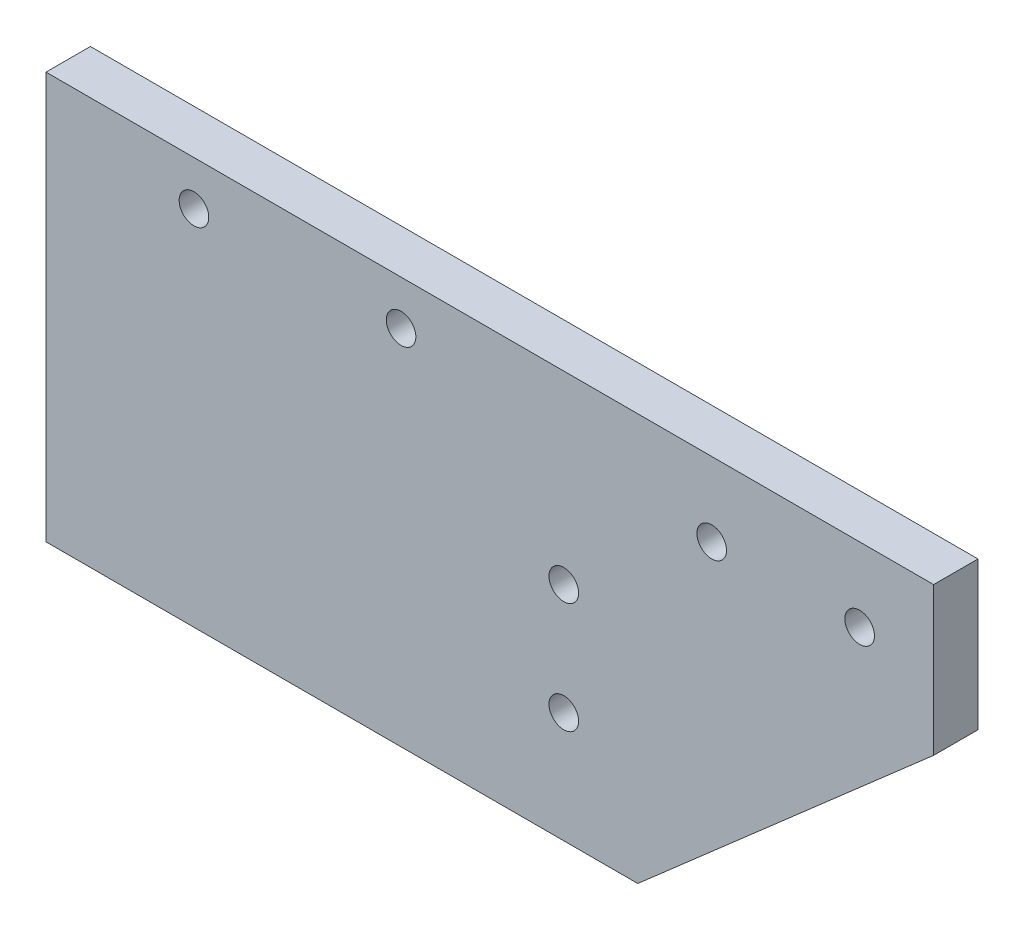
ISO-10303-21;
HEADER;
FILE_DESCRIPTION(('STEP AP214'),'2;1');
FILE_NAME('part.step','',(''),(''),'','','');
FILE_SCHEMA(('AUTOMOTIVE_DESIGN { 1 0 10303 214 1 1 1 1 }'));
ENDSEC;
DATA;
#1=APPLICATION_CONTEXT('core data for automotive mechanical design processes');
#2=APPLICATION_PROTOCOL_DEFINITION('international standard','automotive_design',2000,#1);
#3=PRODUCT_CONTEXT('',#1,'mechanical');
#4=PRODUCT('Part','Part','',(#3));
#5=PRODUCT_RELATED_PRODUCT_CATEGORY('part','',(#4));
#6=PRODUCT_DEFINITION_FORMATION('','',#4);
#7=PRODUCT_DEFINITION_CONTEXT('part definition',#1,'design');
#8=PRODUCT_DEFINITION('design','',#6,#7);
#9=PRODUCT_DEFINITION_SHAPE('','',#8);
#10=(LENGTH_UNIT() NAMED_UNIT(*) SI_UNIT(.MILLI.,.METRE.));
#11=(NAMED_UNIT(*) PLANE_ANGLE_UNIT() SI_UNIT($,.RADIAN.));
#12=(NAMED_UNIT(*) SI_UNIT($,.STERADIAN.) SOLID_ANGLE_UNIT());
#13=UNCERTAINTY_MEASURE_WITH_UNIT(LENGTH_MEASURE(1.E-05),#10,'distance_accuracy_value','');
#14=(GEOMETRIC_REPRESENTATION_CONTEXT(3) GLOBAL_UNCERTAINTY_ASSIGNED_CONTEXT((#13)) GLOBAL_UNIT_ASSIGNED_CONTEXT((#10,
#11,#12)) REPRESENTATION_CONTEXT('',''));
#15=CARTESIAN_POINT('',(0.,0.,0.));
#16=DIRECTION('',(0.,0.,1.));
#17=DIRECTION('',(1.,0.,0.));
#18=AXIS2_PLACEMENT_3D('',#15,#16,#17);
#19=CARTESIAN_POINT('',(0.,0.,6.));
#20=DIRECTION('',(0.,0.,-1.));
#21=DIRECTION('',(-1.,0.,0.));
#22=AXIS2_PLACEMENT_3D('',#19,#20,#21);
#23=PLANE('',#22);
#24=DIRECTION('',(-1.,0.,0.));
#25=VECTOR('',#24,1.);
#26=CARTESIAN_POINT('',(-60.,0.,6.));
#27=LINE('',#26,#25);
#28=CARTESIAN_POINT('',(60.,0.,6.));
#29=VERTEX_POINT('',#28);
#30=CARTESIAN_POINT('',(-60.,0.,6.));
#31=VERTEX_POINT('',#30);
#32=EDGE_CURVE('E50',#29,#31,#27,.T.);
#33=ORIENTED_EDGE('',*,*,#32,.T.);
#34=DIRECTION('',(0.,-1.,0.));
#35=VECTOR('',#34,1.);
#36=CARTESIAN_POINT('',(-60.,-55.,6.));
#37=LINE('',#36,#35);
#38=CARTESIAN_POINT('',(-60.,-55.,6.));
#39=VERTEX_POINT('',#38);
#40=EDGE_CURVE('E85',#31,#39,#37,.T.);
#41=ORIENTED_EDGE('',*,*,#40,.T.);
#42=DIRECTION('',(1.,0.,0.));
#43=VECTOR('',#42,1.);
#44=CARTESIAN_POINT('',(-60.,-55.,6.));
#45=LINE('',#44,#43);
#46=CARTESIAN_POINT('',(20.,-55.,6.));
#47=VERTEX_POINT('',#46);
#48=EDGE_CURVE('E90',#39,#47,#45,.T.);
#49=ORIENTED_EDGE('',*,*,#48,.T.);
#50=DIRECTION('',(0.752576694706878,0.658504607868518,0.));
#51=VECTOR('',#50,1.);
#52=CARTESIAN_POINT('',(20.,-55.,6.));
#53=LINE('',#52,#51);
#54=CARTESIAN_POINT('',(60.,-20.,6.));
#55=VERTEX_POINT('',#54);
#56=EDGE_CURVE('E94',#47,#55,#53,.T.);
#57=ORIENTED_EDGE('',*,*,#56,.T.);
#58=DIRECTION('',(0.,1.,0.));
#59=VECTOR('',#58,1.);
#60=CARTESIAN_POINT('',(60.,0.,6.));
#61=LINE('',#60,#59);
#62=EDGE_CURVE('E105',#55,#29,#61,.T.);
#63=ORIENTED_EDGE('',*,*,#62,.T.);
#64=EDGE_LOOP('',(#33,#41,#49,#57,#63));
#65=FACE_BOUND('',#64,.T.);
#66=CARTESIAN_POINT('',(50.,-10.,6.));
#67=DIRECTION('',(0.,0.,1.));
#68=DIRECTION('',(1.,0.,0.));
#69=AXIS2_PLACEMENT_3D('',#66,#67,#68);
#70=CIRCLE('',#69,2.);
#71=CARTESIAN_POINT('',(52.,-10.,6.));
#72=VERTEX_POINT('',#71);
#73=EDGE_CURVE('E114',#72,#72,#70,.T.);
#74=ORIENTED_EDGE('',*,*,#73,.F.);
#75=EDGE_LOOP('',(#74));
#76=FACE_BOUND('',#75,.T.);
#77=CARTESIAN_POINT('',(30.,-10.,6.));
#78=DIRECTION('',(0.,0.,1.));
#79=DIRECTION('',(1.,0.,0.));
#80=AXIS2_PLACEMENT_3D('',#77,#78,#79);
#81=CIRCLE('',#80,2.);
#82=CARTESIAN_POINT('',(32.,-10.,6.));
#83=VERTEX_POINT('',#82);
#84=EDGE_CURVE('E133',#83,#83,#81,.T.);
#85=ORIENTED_EDGE('',*,*,#84,.F.);
#86=EDGE_LOOP('',(#85));
#87=FACE_BOUND('',#86,.T.);
#88=CARTESIAN_POINT('',(10.,-40.,6.));
#89=DIRECTION('',(0.,0.,1.));
#90=DIRECTION('',(1.,0.,0.));
#91=AXIS2_PLACEMENT_3D('',#88,#89,#90);
#92=CIRCLE('',#91,2.);
#93=CARTESIAN_POINT('',(12.,-40.,6.));
#94=VERTEX_POINT('',#93);
#95=EDGE_CURVE('E139',#94,#94,#92,.T.);
#96=ORIENTED_EDGE('',*,*,#95,.F.);
#97=EDGE_LOOP('',(#96));
#98=FACE_BOUND('',#97,.T.);
#99=CARTESIAN_POINT('',(10.,-25.,6.));
#100=DIRECTION('',(0.,0.,1.));
#101=DIRECTION('',(1.,0.,0.));
#102=AXIS2_PLACEMENT_3D('',#99,#100,#101);
#103=CIRCLE('',#102,2.);
#104=CARTESIAN_POINT('',(12.,-25.,6.));
#105=VERTEX_POINT('',#104);
#106=EDGE_CURVE('E145',#105,#105,#103,.T.);
#107=ORIENTED_EDGE('',*,*,#106,.F.);
#108=EDGE_LOOP('',(#107));
#109=FACE_BOUND('',#108,.T.);
#110=CARTESIAN_POINT('',(-39.9999999999975,-5.99999999999944,6.));
#111=DIRECTION('',(0.,0.,1.));
#112=DIRECTION('',(1.,0.,0.));
#113=AXIS2_PLACEMENT_3D('',#110,#111,#112);
#114=CIRCLE('',#113,1.99999999999827);
#115=CARTESIAN_POINT('',(-37.9999999999992,-5.99999999999944,6.));
#116=VERTEX_POINT('',#115);
#117=EDGE_CURVE('E151',#116,#116,#114,.T.);
#118=ORIENTED_EDGE('',*,*,#117,.F.);
#119=EDGE_LOOP('',(#118));
#120=FACE_BOUND('',#119,.T.);
#121=CARTESIAN_POINT('',(-11.9999999999974,-5.99999999999967,6.));
#122=DIRECTION('',(0.,0.,1.));
#123=DIRECTION('',(1.,0.,0.));
#124=AXIS2_PLACEMENT_3D('',#121,#122,#123);
#125=CIRCLE('',#124,2.00000000000225);
#126=CARTESIAN_POINT('',(-9.99999999999518,-5.99999999999967,6.));
#127=VERTEX_POINT('',#126);
#128=EDGE_CURVE('E157',#127,#127,#125,.T.);
#129=ORIENTED_EDGE('',*,*,#128,.F.);
#130=EDGE_LOOP('',(#129));
#131=FACE_BOUND('',#130,.T.);
#132=ADVANCED_FACE('F33',(#65,#76,#87,#98,#109,#120,#131),#23,.F.);
#133=CARTESIAN_POINT('',(0.,0.,0.));
#134=DIRECTION('',(0.,0.,-1.));
#135=DIRECTION('',(-1.,0.,0.));
#136=AXIS2_PLACEMENT_3D('',#133,#134,#135);
#137=PLANE('',#136);
#138=CARTESIAN_POINT('',(-39.9999999999975,-5.99999999999944,0.));
#139=DIRECTION('',(0.,0.,1.));
#140=DIRECTION('',(1.,0.,0.));
#141=AXIS2_PLACEMENT_3D('',#138,#139,#140);
#142=CIRCLE('',#141,1.99999999999827);
#143=CARTESIAN_POINT('',(-37.9999999999992,-5.99999999999944,0.));
#144=VERTEX_POINT('',#143);
#145=EDGE_CURVE('E154',#144,#144,#142,.T.);
#146=ORIENTED_EDGE('',*,*,#145,.T.);
#147=EDGE_LOOP('',(#146));
#148=FACE_BOUND('',#147,.T.);
#149=CARTESIAN_POINT('',(10.,-40.,0.));
#150=DIRECTION('',(0.,0.,1.));
#151=DIRECTION('',(1.,0.,0.));
#152=AXIS2_PLACEMENT_3D('',#149,#150,#151);
#153=CIRCLE('',#152,2.);
#154=CARTESIAN_POINT('',(12.,-40.,0.));
#155=VERTEX_POINT('',#154);
#156=EDGE_CURVE('E142',#155,#155,#153,.T.);
#157=ORIENTED_EDGE('',*,*,#156,.T.);
#158=EDGE_LOOP('',(#157));
#159=FACE_BOUND('',#158,.T.);
#160=CARTESIAN_POINT('',(50.,-10.,0.));
#161=DIRECTION('',(0.,0.,1.));
#162=DIRECTION('',(1.,0.,0.));
#163=AXIS2_PLACEMENT_3D('',#160,#161,#162);
#164=CIRCLE('',#163,2.);
#165=CARTESIAN_POINT('',(52.,-10.,0.));
#166=VERTEX_POINT('',#165);
#167=EDGE_CURVE('E130',#166,#166,#164,.T.);
#168=ORIENTED_EDGE('',*,*,#167,.T.);
#169=EDGE_LOOP('',(#168));
#170=FACE_BOUND('',#169,.T.);
#171=DIRECTION('',(0.,-1.,0.));
#172=VECTOR('',#171,1.);
#173=CARTESIAN_POINT('',(-60.,-55.,0.));
#174=LINE('',#173,#172);
#175=CARTESIAN_POINT('',(-60.,0.,0.));
#176=VERTEX_POINT('',#175);
#177=CARTESIAN_POINT('',(-60.,-55.,0.));
#178=VERTEX_POINT('',#177);
#179=EDGE_CURVE('E111',#176,#178,#174,.T.);
#180=ORIENTED_EDGE('',*,*,#179,.F.);
#181=DIRECTION('',(-1.,0.,0.));
#182=VECTOR('',#181,1.);
#183=CARTESIAN_POINT('',(0.,0.,0.));
#184=LINE('',#183,#182);
#185=CARTESIAN_POINT('',(60.,0.,0.));
#186=VERTEX_POINT('',#185);
#187=EDGE_CURVE('E118',#186,#176,#184,.T.);
#188=ORIENTED_EDGE('',*,*,#187,.F.);
#189=DIRECTION('',(0.,1.,0.));
#190=VECTOR('',#189,1.);
#191=CARTESIAN_POINT('',(60.,0.,0.));
#192=LINE('',#191,#190);
#193=CARTESIAN_POINT('',(60.,-20.,0.));
#194=VERTEX_POINT('',#193);
#195=EDGE_CURVE('E78',#194,#186,#192,.T.);
#196=ORIENTED_EDGE('',*,*,#195,.F.);
#197=DIRECTION('',(0.752576694706878,0.658504607868518,0.));
#198=VECTOR('',#197,1.);
#199=CARTESIAN_POINT('',(20.,-55.,0.));
#200=LINE('',#199,#198);
#201=CARTESIAN_POINT('',(20.,-55.,0.));
#202=VERTEX_POINT('',#201);
#203=EDGE_CURVE('E71',#202,#194,#200,.T.);
#204=ORIENTED_EDGE('',*,*,#203,.F.);
#205=DIRECTION('',(1.,0.,0.));
#206=VECTOR('',#205,1.);
#207=CARTESIAN_POINT('',(0.,-55.,0.));
#208=LINE('',#207,#206);
#209=EDGE_CURVE('E100',#178,#202,#208,.T.);
#210=ORIENTED_EDGE('',*,*,#209,.F.);
#211=EDGE_LOOP('',(#180,#188,#196,#204,#210));
#212=FACE_BOUND('',#211,.T.);
#213=CARTESIAN_POINT('',(30.,-10.,0.));
#214=DIRECTION('',(0.,0.,1.));
#215=DIRECTION('',(1.,0.,0.));
#216=AXIS2_PLACEMENT_3D('',#213,#214,#215);
#217=CIRCLE('',#216,2.);
#218=CARTESIAN_POINT('',(32.,-10.,0.));
#219=VERTEX_POINT('',#218);
#220=EDGE_CURVE('E136',#219,#219,#217,.T.);
#221=ORIENTED_EDGE('',*,*,#220,.T.);
#222=EDGE_LOOP('',(#221));
#223=FACE_BOUND('',#222,.T.);
#224=CARTESIAN_POINT('',(10.,-25.,0.));
#225=DIRECTION('',(0.,0.,1.));
#226=DIRECTION('',(1.,0.,0.));
#227=AXIS2_PLACEMENT_3D('',#224,#225,#226);
#228=CIRCLE('',#227,2.);
#229=CARTESIAN_POINT('',(12.,-25.,0.));
#230=VERTEX_POINT('',#229);
#231=EDGE_CURVE('E148',#230,#230,#228,.T.);
#232=ORIENTED_EDGE('',*,*,#231,.T.);
#233=EDGE_LOOP('',(#232));
#234=FACE_BOUND('',#233,.T.);
#235=CARTESIAN_POINT('',(-11.9999999999974,-5.99999999999967,0.));
#236=DIRECTION('',(0.,0.,1.));
#237=DIRECTION('',(1.,0.,0.));
#238=AXIS2_PLACEMENT_3D('',#235,#236,#237);
#239=CIRCLE('',#238,2.00000000000225);
#240=CARTESIAN_POINT('',(-9.99999999999518,-5.99999999999967,0.));
#241=VERTEX_POINT('',#240);
#242=EDGE_CURVE('E160',#241,#241,#239,.T.);
#243=ORIENTED_EDGE('',*,*,#242,.T.);
#244=EDGE_LOOP('',(#243));
#245=FACE_BOUND('',#244,.T.);
#246=ADVANCED_FACE('F124',(#148,#159,#170,#212,#223,#234,#245),#137,.T.);
#247=CARTESIAN_POINT('',(-60.,-55.,6.));
#248=DIRECTION('',(1.,0.,0.));
#249=DIRECTION('',(0.,0.,-1.));
#250=AXIS2_PLACEMENT_3D('',#247,#248,#249);
#251=PLANE('',#250);
#252=ORIENTED_EDGE('',*,*,#179,.T.);
#253=DIRECTION('',(0.,0.,-1.));
#254=VECTOR('',#253,1.);
#255=CARTESIAN_POINT('',(-60.,-55.,6.));
#256=LINE('',#255,#254);
#257=EDGE_CURVE('E42',#39,#178,#256,.T.);
#258=ORIENTED_EDGE('',*,*,#257,.F.);
#259=ORIENTED_EDGE('',*,*,#40,.F.);
#260=DIRECTION('',(0.,0.,-1.));
#261=VECTOR('',#260,1.);
#262=CARTESIAN_POINT('',(-60.,0.,6.));
#263=LINE('',#262,#261);
#264=EDGE_CURVE('E11',#31,#176,#263,.T.);
#265=ORIENTED_EDGE('',*,*,#264,.T.);
#266=EDGE_LOOP('',(#252,#258,#259,#265));
#267=FACE_BOUND('',#266,.T.);
#268=ADVANCED_FACE('F35',(#267),#251,.F.);
#269=CARTESIAN_POINT('',(0.,-55.,6.));
#270=DIRECTION('',(0.,1.,0.));
#271=DIRECTION('',(-1.,0.,0.));
#272=AXIS2_PLACEMENT_3D('',#269,#270,#271);
#273=PLANE('',#272);
#274=ORIENTED_EDGE('',*,*,#209,.T.);
#275=DIRECTION('',(0.,0.,-1.));
#276=VECTOR('',#275,1.);
#277=CARTESIAN_POINT('',(20.,-55.,6.));
#278=LINE('',#277,#276);
#279=EDGE_CURVE('E98',#47,#202,#278,.T.);
#280=ORIENTED_EDGE('',*,*,#279,.F.);
#281=ORIENTED_EDGE('',*,*,#48,.F.);
#282=ORIENTED_EDGE('',*,*,#257,.T.);
#283=EDGE_LOOP('',(#274,#280,#281,#282));
#284=FACE_BOUND('',#283,.T.);
#285=ADVANCED_FACE('F99',(#284),#273,.F.);
#286=CARTESIAN_POINT('',(20.,-55.,6.));
#287=DIRECTION('',(-0.658504607868518,0.752576694706878,0.));
#288=DIRECTION('',(-0.752576694706878,-0.658504607868518,0.));
#289=AXIS2_PLACEMENT_3D('',#286,#287,#288);
#290=PLANE('',#289);
#291=ORIENTED_EDGE('',*,*,#203,.T.);
#292=DIRECTION('',(0.,0.,-1.));
#293=VECTOR('',#292,1.);
#294=CARTESIAN_POINT('',(60.,-20.,6.));
#295=LINE('',#294,#293);
#296=EDGE_CURVE('E101',#55,#194,#295,.T.);
#297=ORIENTED_EDGE('',*,*,#296,.F.);
#298=ORIENTED_EDGE('',*,*,#56,.F.);
#299=ORIENTED_EDGE('',*,*,#279,.T.);
#300=EDGE_LOOP('',(#291,#297,#298,#299));
#301=FACE_BOUND('',#300,.T.);
#302=ADVANCED_FACE('F103',(#301),#290,.F.);
#303=CARTESIAN_POINT('',(60.,0.,6.));
#304=DIRECTION('',(-1.,0.,0.));
#305=DIRECTION('',(0.,0.,1.));
#306=AXIS2_PLACEMENT_3D('',#303,#304,#305);
#307=PLANE('',#306);
#308=ORIENTED_EDGE('',*,*,#195,.T.);
#309=DIRECTION('',(0.,0.,-1.));
#310=VECTOR('',#309,1.);
#311=CARTESIAN_POINT('',(60.,0.,6.));
#312=LINE('',#311,#310);
#313=EDGE_CURVE('E107',#29,#186,#312,.T.);
#314=ORIENTED_EDGE('',*,*,#313,.F.);
#315=ORIENTED_EDGE('',*,*,#62,.F.);
#316=ORIENTED_EDGE('',*,*,#296,.T.);
#317=EDGE_LOOP('',(#308,#314,#315,#316));
#318=FACE_BOUND('',#317,.T.);
#319=ADVANCED_FACE('F127',(#318),#307,.F.);
#320=CARTESIAN_POINT('',(0.,0.,6.));
#321=DIRECTION('',(0.,-1.,0.));
#322=DIRECTION('',(0.,0.,-1.));
#323=AXIS2_PLACEMENT_3D('',#320,#321,#322);
#324=PLANE('',#323);
#325=ORIENTED_EDGE('',*,*,#187,.T.);
#326=ORIENTED_EDGE('',*,*,#264,.F.);
#327=ORIENTED_EDGE('',*,*,#32,.F.);
#328=ORIENTED_EDGE('',*,*,#313,.T.);
#329=EDGE_LOOP('',(#325,#326,#327,#328));
#330=FACE_BOUND('',#329,.T.);
#331=ADVANCED_FACE('F126',(#330),#324,.F.);
#332=CARTESIAN_POINT('',(50.,-10.,6.));
#333=DIRECTION('',(0.,0.,-1.));
#334=DIRECTION('',(-1.,0.,0.));
#335=AXIS2_PLACEMENT_3D('',#332,#333,#334);
#336=CYLINDRICAL_SURFACE('',#335,2.);
#337=ORIENTED_EDGE('',*,*,#73,.T.);
#338=EDGE_LOOP('',(#337));
#339=FACE_BOUND('',#338,.T.);
#340=ORIENTED_EDGE('',*,*,#167,.F.);
#341=EDGE_LOOP('',(#340));
#342=FACE_BOUND('',#341,.T.);
#343=ADVANCED_FACE('F177',(#339,#342),#336,.F.);
#344=CARTESIAN_POINT('',(30.,-10.,6.));
#345=DIRECTION('',(0.,0.,-1.));
#346=DIRECTION('',(-1.,0.,0.));
#347=AXIS2_PLACEMENT_3D('',#344,#345,#346);
#348=CYLINDRICAL_SURFACE('',#347,2.);
#349=ORIENTED_EDGE('',*,*,#84,.T.);
#350=EDGE_LOOP('',(#349));
#351=FACE_BOUND('',#350,.T.);
#352=ORIENTED_EDGE('',*,*,#220,.F.);
#353=EDGE_LOOP('',(#352));
#354=FACE_BOUND('',#353,.T.);
#355=ADVANCED_FACE('F236',(#351,#354),#348,.F.);
#356=CARTESIAN_POINT('',(10.,-40.,6.));
#357=DIRECTION('',(0.,0.,-1.));
#358=DIRECTION('',(-1.,0.,0.));
#359=AXIS2_PLACEMENT_3D('',#356,#357,#358);
#360=CYLINDRICAL_SURFACE('',#359,2.);
#361=ORIENTED_EDGE('',*,*,#95,.T.);
#362=EDGE_LOOP('',(#361));
#363=FACE_BOUND('',#362,.T.);
#364=ORIENTED_EDGE('',*,*,#156,.F.);
#365=EDGE_LOOP('',(#364));
#366=FACE_BOUND('',#365,.T.);
#367=ADVANCED_FACE('F244',(#363,#366),#360,.F.);
#368=CARTESIAN_POINT('',(10.,-25.,6.));
#369=DIRECTION('',(0.,0.,-1.));
#370=DIRECTION('',(-1.,0.,0.));
#371=AXIS2_PLACEMENT_3D('',#368,#369,#370);
#372=CYLINDRICAL_SURFACE('',#371,2.);
#373=ORIENTED_EDGE('',*,*,#106,.T.);
#374=EDGE_LOOP('',(#373));
#375=FACE_BOUND('',#374,.T.);
#376=ORIENTED_EDGE('',*,*,#231,.F.);
#377=EDGE_LOOP('',(#376));
#378=FACE_BOUND('',#377,.T.);
#379=ADVANCED_FACE('F252',(#375,#378),#372,.F.);
#380=CARTESIAN_POINT('',(-39.9999999999975,-5.99999999999944,6.));
#381=DIRECTION('',(0.,0.,-1.));
#382=DIRECTION('',(-1.,0.,0.));
#383=AXIS2_PLACEMENT_3D('',#380,#381,#382);
#384=CYLINDRICAL_SURFACE('',#383,1.99999999999827);
#385=ORIENTED_EDGE('',*,*,#117,.T.);
#386=EDGE_LOOP('',(#385));
#387=FACE_BOUND('',#386,.T.);
#388=ORIENTED_EDGE('',*,*,#145,.F.);
#389=EDGE_LOOP('',(#388));
#390=FACE_BOUND('',#389,.T.);
#391=ADVANCED_FACE('F261',(#387,#390),#384,.F.);
#392=CARTESIAN_POINT('',(-11.9999999999974,-5.99999999999967,6.));
#393=DIRECTION('',(0.,0.,-1.));
#394=DIRECTION('',(-1.,0.,0.));
#395=AXIS2_PLACEMENT_3D('',#392,#393,#394);
#396=CYLINDRICAL_SURFACE('',#395,2.00000000000225);
#397=ORIENTED_EDGE('',*,*,#128,.T.);
#398=EDGE_LOOP('',(#397));
#399=FACE_BOUND('',#398,.T.);
#400=ORIENTED_EDGE('',*,*,#242,.F.);
#401=EDGE_LOOP('',(#400));
#402=FACE_BOUND('',#401,.T.);
#403=ADVANCED_FACE('F166',(#399,#402),#396,.F.);
#404=CLOSED_SHELL('',(#132,#246,#268,#285,#302,#319,#331,#343,#355,#367,#379,#391,#403));
#405=MANIFOLD_SOLID_BREP('B2',#404);
#406=ADVANCED_BREP_SHAPE_REPRESENTATION('',(#18,#405),#14);
#407=SHAPE_DEFINITION_REPRESENTATION(#9,#406);
ENDSEC;
END-ISO-10303-21;
